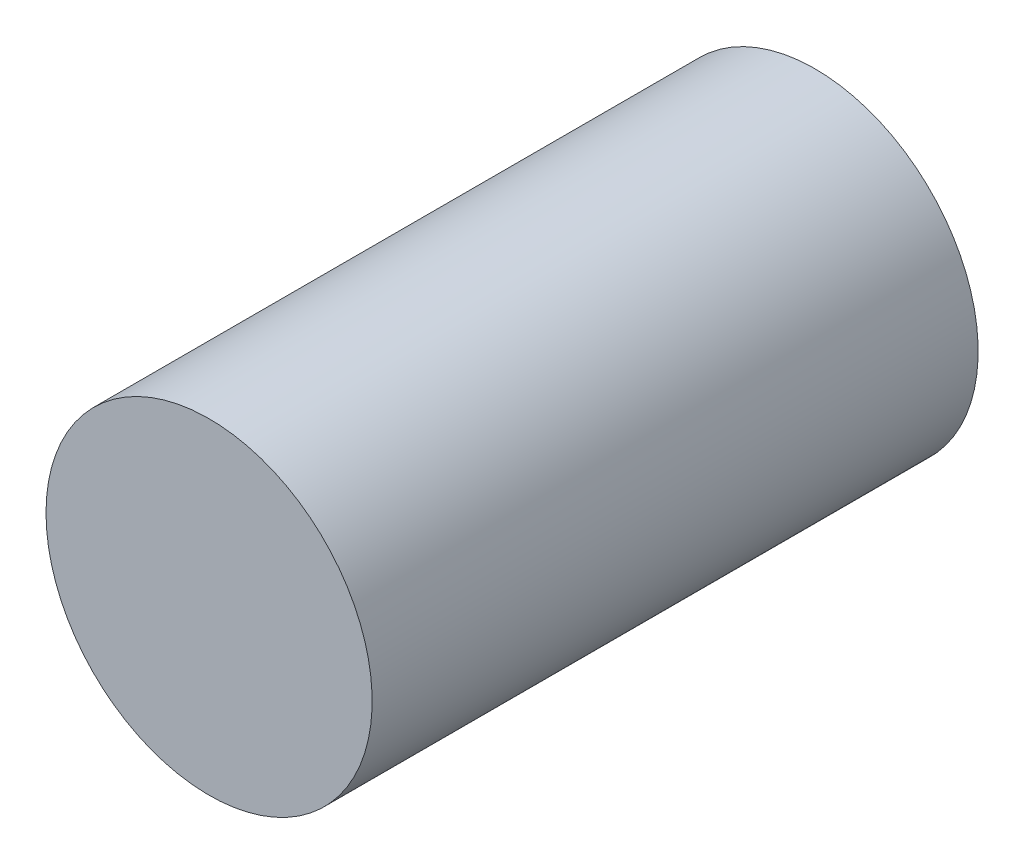
ISO-10303-21;
HEADER;
FILE_DESCRIPTION(('STEP AP214'),'2;1');
FILE_NAME('part.step','',(''),(''),'','','');
FILE_SCHEMA(('AUTOMOTIVE_DESIGN { 1 0 10303 214 1 1 1 1 }'));
ENDSEC;
DATA;
#1=APPLICATION_CONTEXT('core data for automotive mechanical design processes');
#2=APPLICATION_PROTOCOL_DEFINITION('international standard','automotive_design',2000,#1);
#3=PRODUCT_CONTEXT('',#1,'mechanical');
#4=PRODUCT('Part','Part','',(#3));
#5=PRODUCT_RELATED_PRODUCT_CATEGORY('part','',(#4));
#6=PRODUCT_DEFINITION_FORMATION('','',#4);
#7=PRODUCT_DEFINITION_CONTEXT('part definition',#1,'design');
#8=PRODUCT_DEFINITION('design','',#6,#7);
#9=PRODUCT_DEFINITION_SHAPE('','',#8);
#10=(LENGTH_UNIT() NAMED_UNIT(*) SI_UNIT(.MILLI.,.METRE.));
#11=(NAMED_UNIT(*) PLANE_ANGLE_UNIT() SI_UNIT($,.RADIAN.));
#12=(NAMED_UNIT(*) SI_UNIT($,.STERADIAN.) SOLID_ANGLE_UNIT());
#13=UNCERTAINTY_MEASURE_WITH_UNIT(LENGTH_MEASURE(1.E-05),#10,'distance_accuracy_value','');
#14=(GEOMETRIC_REPRESENTATION_CONTEXT(3) GLOBAL_UNCERTAINTY_ASSIGNED_CONTEXT((#13)) GLOBAL_UNIT_ASSIGNED_CONTEXT((#10,
#11,#12)) REPRESENTATION_CONTEXT('',''));
#15=CARTESIAN_POINT('',(0.,0.,0.));
#16=DIRECTION('',(0.,0.,1.));
#17=DIRECTION('',(1.,0.,0.));
#18=AXIS2_PLACEMENT_3D('',#15,#16,#17);
#19=CARTESIAN_POINT('',(0.,0.,12.5));
#20=DIRECTION('',(0.,0.,-0.999999999999992));
#21=DIRECTION('',(-0.999999999999999,0.,0.));
#22=AXIS2_PLACEMENT_3D('',#19,#20,#21);
#23=CYLINDRICAL_SURFACE('',#22,6.72770575);
#24=CARTESIAN_POINT('',(0.,0.,12.5));
#25=DIRECTION('',(0.,0.,0.999999999999992));
#26=DIRECTION('',(0.999999999999999,0.,0.));
#27=AXIS2_PLACEMENT_3D('',#24,#25,#26);
#28=CIRCLE('',#27,6.72770575);
#29=CARTESIAN_POINT('',(-6.72770574999999,0.,12.5));
#30=VERTEX_POINT('',#29);
#31=EDGE_CURVE('E11',#30,#30,#28,.T.);
#32=CARTESIAN_POINT('',(0.,0.,-12.5));
#33=DIRECTION('',(0.,0.,0.999999999999992));
#34=DIRECTION('',(0.999999999999999,0.,0.));
#35=AXIS2_PLACEMENT_3D('',#32,#33,#34);
#36=CIRCLE('',#35,6.72770575);
#37=CARTESIAN_POINT('',(-6.72770574999999,0.,-12.5));
#38=VERTEX_POINT('',#37);
#39=EDGE_CURVE('E48',#38,#38,#36,.T.);
#40=CARTESIAN_POINT('',(-6.72770574999999,0.,12.5));
#41=CARTESIAN_POINT('',(-6.72770574999999,0.,12.2395833333333));
#42=CARTESIAN_POINT('',(-6.72770574999999,0.,11.9791666666666));
#43=CARTESIAN_POINT('',(-6.72770574999999,0.,11.4583333333333));
#44=CARTESIAN_POINT('',(-6.72770574999999,0.,11.1979166666666));
#45=CARTESIAN_POINT('',(-6.72770574999999,0.,10.6770833333333));
#46=CARTESIAN_POINT('',(-6.72770574999999,0.,10.4166666666666));
#47=CARTESIAN_POINT('',(-6.72770574999999,0.,9.8958333333333));
#48=CARTESIAN_POINT('',(-6.72770574999999,0.,9.63541666666663));
#49=CARTESIAN_POINT('',(-6.72770574999999,0.,9.1145833333333));
#50=CARTESIAN_POINT('',(-6.72770574999999,0.,8.85416666666664));
#51=CARTESIAN_POINT('',(-6.72770574999999,0.,8.3333333333333));
#52=CARTESIAN_POINT('',(-6.72770574999999,0.,8.07291666666664));
#53=CARTESIAN_POINT('',(-6.72770574999999,0.,7.55208333333331));
#54=CARTESIAN_POINT('',(-6.72770574999999,0.,7.29166666666664));
#55=CARTESIAN_POINT('',(-6.72770574999999,0.,6.77083333333331));
#56=CARTESIAN_POINT('',(-6.72770574999999,0.,6.51041666666664));
#57=CARTESIAN_POINT('',(-6.72770574999999,0.,5.98958333333331));
#58=CARTESIAN_POINT('',(-6.72770574999999,0.,5.72916666666665));
#59=CARTESIAN_POINT('',(-6.72770574999999,0.,5.20833333333332));
#60=CARTESIAN_POINT('',(-6.72770574999999,0.,4.94791666666665));
#61=CARTESIAN_POINT('',(-6.72770574999999,0.,4.42708333333332));
#62=CARTESIAN_POINT('',(-6.72770574999999,0.,4.16666666666665));
#63=CARTESIAN_POINT('',(-6.72770574999999,0.,3.64583333333332));
#64=CARTESIAN_POINT('',(-6.72770574999999,0.,3.38541666666666));
#65=CARTESIAN_POINT('',(-6.72770574999999,0.,2.86458333333332));
#66=CARTESIAN_POINT('',(-6.72770574999999,0.,2.60416666666666));
#67=CARTESIAN_POINT('',(-6.72770574999999,0.,2.08333333333333));
#68=CARTESIAN_POINT('',(-6.72770574999999,0.,1.82291666666666));
#69=CARTESIAN_POINT('',(-6.72770574999999,0.,1.30208333333333));
#70=CARTESIAN_POINT('',(-6.72770574999999,0.,1.04166666666666));
#71=CARTESIAN_POINT('',(-6.72770574999999,0.,0.520833333333331));
#72=CARTESIAN_POINT('',(-6.72770574999999,0.,0.260416666666666));
#73=CARTESIAN_POINT('',(-6.72770574999999,0.,-0.260416666666665));
#74=CARTESIAN_POINT('',(-6.72770574999999,0.,-0.52083333333333));
#75=CARTESIAN_POINT('',(-6.72770574999999,0.,-1.04166666666666));
#76=CARTESIAN_POINT('',(-6.72770574999999,0.,-1.30208333333333));
#77=CARTESIAN_POINT('',(-6.72770574999999,0.,-1.82291666666666));
#78=CARTESIAN_POINT('',(-6.72770574999999,0.,-2.08333333333333));
#79=CARTESIAN_POINT('',(-6.72770574999999,0.,-2.60416666666666));
#80=CARTESIAN_POINT('',(-6.72770574999999,0.,-2.86458333333332));
#81=CARTESIAN_POINT('',(-6.72770574999999,0.,-3.38541666666665));
#82=CARTESIAN_POINT('',(-6.72770574999999,0.,-3.64583333333332));
#83=CARTESIAN_POINT('',(-6.72770574999999,0.,-4.16666666666665));
#84=CARTESIAN_POINT('',(-6.72770574999999,0.,-4.42708333333332));
#85=CARTESIAN_POINT('',(-6.72770574999999,0.,-4.94791666666665));
#86=CARTESIAN_POINT('',(-6.72770574999999,0.,-5.20833333333331));
#87=CARTESIAN_POINT('',(-6.72770574999999,0.,-5.72916666666665));
#88=CARTESIAN_POINT('',(-6.72770574999999,0.,-5.98958333333331));
#89=CARTESIAN_POINT('',(-6.72770574999999,0.,-6.51041666666664));
#90=CARTESIAN_POINT('',(-6.72770574999999,0.,-6.77083333333331));
#91=CARTESIAN_POINT('',(-6.72770574999999,0.,-7.29166666666664));
#92=CARTESIAN_POINT('',(-6.72770574999999,0.,-7.55208333333331));
#93=CARTESIAN_POINT('',(-6.72770574999999,0.,-8.07291666666664));
#94=CARTESIAN_POINT('',(-6.72770574999999,0.,-8.3333333333333));
#95=CARTESIAN_POINT('',(-6.72770574999999,0.,-8.85416666666663));
#96=CARTESIAN_POINT('',(-6.72770574999999,0.,-9.1145833333333));
#97=CARTESIAN_POINT('',(-6.72770574999999,0.,-9.63541666666663));
#98=CARTESIAN_POINT('',(-6.72770574999999,0.,-9.8958333333333));
#99=CARTESIAN_POINT('',(-6.72770574999999,0.,-10.4166666666666));
#100=CARTESIAN_POINT('',(-6.72770574999999,0.,-10.6770833333333));
#101=CARTESIAN_POINT('',(-6.72770574999999,0.,-11.1979166666666));
#102=CARTESIAN_POINT('',(-6.72770574999999,0.,-11.4583333333333));
#103=CARTESIAN_POINT('',(-6.72770574999999,0.,-11.9791666666666));
#104=CARTESIAN_POINT('',(-6.72770574999999,0.,-12.2395833333333));
#105=CARTESIAN_POINT('',(-6.72770574999999,0.,-12.5));
#106=B_SPLINE_CURVE_WITH_KNOTS('',3,(#40,#41,#42,#43,#44,#45,#46,#47,#48,#49,#50,#51,#52,#53,
#54,#55,#56,#57,#58,#59,#60,#61,#62,#63,#64,#65,#66,#67,#68,#69,#70,#71,#72,#73,#74,#75,#76,#77,
#78,#79,#80,#81,#82,#83,#84,#85,#86,#87,#88,#89,#90,#91,#92,#93,#94,#95,#96,#97,#98,#99,#100,
#101,#102,#103,#104,#105),.UNSPECIFIED.,.F.,.F.,(4,2,2,2,2,2,2,2,2,2,2,2,2,2,2,2,2,2,2,2,2,2,2,
2,2,2,2,2,2,2,2,2,4),(0.,0.781249999999997,1.56249999999999,2.34374999999999,3.12499999999999,
3.90624999999999,4.68749999999998,5.46874999999998,6.24999999999998,7.03124999999997,
7.81249999999997,8.59374999999997,9.37499999999996,10.15625,10.9375,11.71875,12.5,13.28125,
14.0625,14.8437499999999,15.6249999999999,16.4062499999999,17.1874999999999,17.9687499999999,
18.7499999999999,19.5312499999999,20.3124999999999,21.0937499999999,21.8749999999999,
22.6562499999999,23.4374999999999,24.2187499999999,24.9999999999999),.UNSPECIFIED.);
#107=EDGE_CURVE('BSEAM44',#30,#38,#106,.T.);
#108=ORIENTED_EDGE('',*,*,#31,.F.);
#109=ORIENTED_EDGE('',*,*,#39,.T.);
#110=ORIENTED_EDGE('',*,*,#107,.T.);
#111=ORIENTED_EDGE('',*,*,#107,.F.);
#112=EDGE_LOOP('',(#108,#110,#109,#111));
#113=FACE_BOUND('',#112,.T.);
#114=ADVANCED_FACE('F44',(#113),#23,.T.);
#115=CARTESIAN_POINT('',(0.,0.,12.5));
#116=DIRECTION('',(0.,0.,0.999999999999992));
#117=DIRECTION('',(0.999999999999999,0.,0.));
#118=AXIS2_PLACEMENT_3D('',#115,#116,#117);
#119=PLANE('',#118);
#120=ORIENTED_EDGE('',*,*,#31,.T.);
#121=EDGE_LOOP('',(#120));
#122=FACE_BOUND('',#121,.T.);
#123=ADVANCED_FACE('F58',(#122),#119,.T.);
#124=CARTESIAN_POINT('',(0.,0.,-12.5));
#125=DIRECTION('',(0.,0.,0.999999999999992));
#126=DIRECTION('',(0.999999999999999,0.,0.));
#127=AXIS2_PLACEMENT_3D('',#124,#125,#126);
#128=PLANE('',#127);
#129=ORIENTED_EDGE('',*,*,#39,.F.);
#130=EDGE_LOOP('',(#129));
#131=FACE_BOUND('',#130,.T.);
#132=ADVANCED_FACE('F59',(#131),#128,.F.);
#133=CLOSED_SHELL('',(#114,#123,#132));
#134=MANIFOLD_SOLID_BREP('B2',#133);
#135=ADVANCED_BREP_SHAPE_REPRESENTATION('',(#18,#134),#14);
#136=SHAPE_DEFINITION_REPRESENTATION(#9,#135);
ENDSEC;
END-ISO-10303-21;
